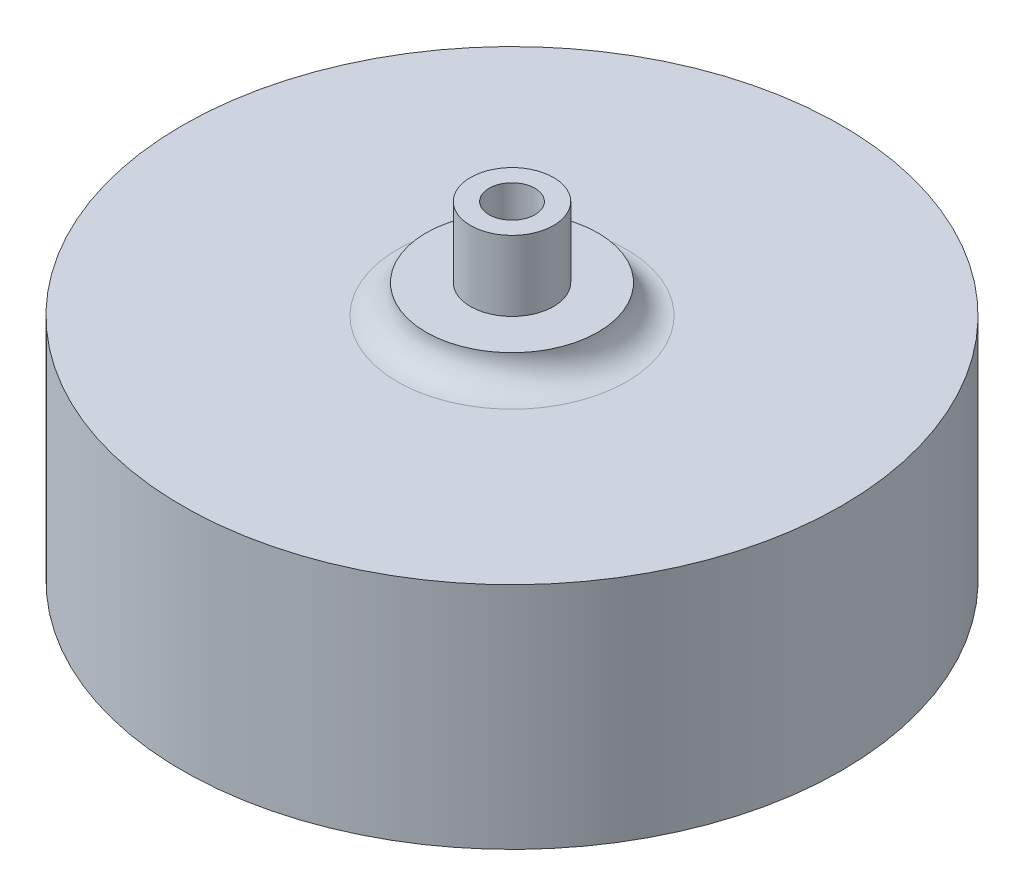
ISO-10303-21;
HEADER;
FILE_DESCRIPTION(('STEP AP214'),'2;1');
FILE_NAME('part.step','',(''),(''),'','','');
FILE_SCHEMA(('AUTOMOTIVE_DESIGN { 1 0 10303 214 1 1 1 1 }'));
ENDSEC;
DATA;
#1=APPLICATION_CONTEXT('core data for automotive mechanical design processes');
#2=APPLICATION_PROTOCOL_DEFINITION('international standard','automotive_design',2000,#1);
#3=PRODUCT_CONTEXT('',#1,'mechanical');
#4=PRODUCT('Part','Part','',(#3));
#5=PRODUCT_RELATED_PRODUCT_CATEGORY('part','',(#4));
#6=PRODUCT_DEFINITION_FORMATION('','',#4);
#7=PRODUCT_DEFINITION_CONTEXT('part definition',#1,'design');
#8=PRODUCT_DEFINITION('design','',#6,#7);
#9=PRODUCT_DEFINITION_SHAPE('','',#8);
#10=(LENGTH_UNIT() NAMED_UNIT(*) SI_UNIT(.MILLI.,.METRE.));
#11=(NAMED_UNIT(*) PLANE_ANGLE_UNIT() SI_UNIT($,.RADIAN.));
#12=(NAMED_UNIT(*) SI_UNIT($,.STERADIAN.) SOLID_ANGLE_UNIT());
#13=UNCERTAINTY_MEASURE_WITH_UNIT(LENGTH_MEASURE(1.E-05),#10,'distance_accuracy_value','');
#14=(GEOMETRIC_REPRESENTATION_CONTEXT(3) GLOBAL_UNCERTAINTY_ASSIGNED_CONTEXT((#13)) GLOBAL_UNIT_ASSIGNED_CONTEXT((#10,
#11,#12)) REPRESENTATION_CONTEXT('',''));
#15=CARTESIAN_POINT('',(0.,0.,0.));
#16=DIRECTION('',(0.,0.,1.));
#17=DIRECTION('',(1.,0.,0.));
#18=AXIS2_PLACEMENT_3D('',#15,#16,#17);
#19=CARTESIAN_POINT('',(-1.6,5.73999456703665,0.));
#20=DIRECTION('',(0.,1.,0.));
#21=DIRECTION('',(-1.,0.,0.));
#22=AXIS2_PLACEMENT_3D('',#19,#20,#21);
#23=CYLINDRICAL_SURFACE('',#22,1.6);
#24=CARTESIAN_POINT('',(-1.6,-29.8,0.));
#25=DIRECTION('',(0.,1.,0.));
#26=DIRECTION('',(-1.,0.,0.));
#27=AXIS2_PLACEMENT_3D('',#24,#25,#26);
#28=CIRCLE('',#27,1.6);
#29=CARTESIAN_POINT('',(-3.2,-29.8,0.));
#30=VERTEX_POINT('',#29);
#31=EDGE_CURVE('E74',#30,#30,#28,.T.);
#32=ORIENTED_EDGE('',*,*,#31,.F.);
#33=EDGE_LOOP('',(#32));
#34=FACE_BOUND('',#33,.T.);
#35=CARTESIAN_POINT('',(-1.6,0.,0.));
#36=DIRECTION('',(0.,1.,0.));
#37=DIRECTION('',(-1.,0.,0.));
#38=AXIS2_PLACEMENT_3D('',#35,#36,#37);
#39=CIRCLE('',#38,1.6);
#40=CARTESIAN_POINT('',(-3.2,0.,0.));
#41=VERTEX_POINT('',#40);
#42=EDGE_CURVE('E44',#41,#41,#39,.T.);
#43=ORIENTED_EDGE('',*,*,#42,.T.);
#44=EDGE_LOOP('',(#43));
#45=FACE_BOUND('',#44,.T.);
#46=ADVANCED_FACE('F33',(#34,#45),#23,.F.);
#47=CARTESIAN_POINT('',(0.,0.,0.));
#48=DIRECTION('',(0.,-1.,0.));
#49=DIRECTION('',(1.,0.,0.));
#50=AXIS2_PLACEMENT_3D('',#47,#48,#49);
#51=PLANE('',#50);
#52=ORIENTED_EDGE('',*,*,#42,.F.);
#53=EDGE_LOOP('',(#52));
#54=FACE_BOUND('',#53,.T.);
#55=CARTESIAN_POINT('',(-1.6,0.,0.));
#56=DIRECTION('',(0.,1.,0.));
#57=DIRECTION('',(-1.,0.,0.));
#58=AXIS2_PLACEMENT_3D('',#55,#56,#57);
#59=CIRCLE('',#58,2.9);
#60=CARTESIAN_POINT('',(-4.5,0.,0.));
#61=VERTEX_POINT('',#60);
#62=EDGE_CURVE('E48',#61,#61,#59,.T.);
#63=ORIENTED_EDGE('',*,*,#62,.T.);
#64=EDGE_LOOP('',(#63));
#65=FACE_BOUND('',#64,.T.);
#66=ADVANCED_FACE('F82',(#54,#65),#51,.F.);
#67=CARTESIAN_POINT('',(-1.6,5.73999456703665,0.));
#68=DIRECTION('',(0.,1.,0.));
#69=DIRECTION('',(-1.,0.,0.));
#70=AXIS2_PLACEMENT_3D('',#67,#68,#69);
#71=CYLINDRICAL_SURFACE('',#70,2.9);
#72=ORIENTED_EDGE('',*,*,#62,.F.);
#73=EDGE_LOOP('',(#72));
#74=FACE_BOUND('',#73,.T.);
#75=CARTESIAN_POINT('',(-1.6,-4.9,0.));
#76=DIRECTION('',(0.,1.,0.));
#77=DIRECTION('',(-1.,0.,0.));
#78=AXIS2_PLACEMENT_3D('',#75,#76,#77);
#79=CIRCLE('',#78,2.9);
#80=CARTESIAN_POINT('',(-4.5,-4.9,0.));
#81=VERTEX_POINT('',#80);
#82=EDGE_CURVE('E53',#81,#81,#79,.T.);
#83=ORIENTED_EDGE('',*,*,#82,.T.);
#84=EDGE_LOOP('',(#83));
#85=FACE_BOUND('',#84,.T.);
#86=ADVANCED_FACE('F88',(#74,#85),#71,.T.);
#87=CARTESIAN_POINT('',(1.3,-4.9,0.));
#88=DIRECTION('',(0.,-1.,0.));
#89=DIRECTION('',(1.,0.,0.));
#90=AXIS2_PLACEMENT_3D('',#87,#88,#89);
#91=PLANE('',#90);
#92=ORIENTED_EDGE('',*,*,#82,.F.);
#93=EDGE_LOOP('',(#92));
#94=FACE_BOUND('',#93,.T.);
#95=CARTESIAN_POINT('',(-1.6,-4.9,0.));
#96=DIRECTION('',(0.,1.,0.));
#97=DIRECTION('',(-1.,0.,0.));
#98=AXIS2_PLACEMENT_3D('',#95,#96,#97);
#99=CIRCLE('',#98,6.);
#100=CARTESIAN_POINT('',(-7.6,-4.9,0.));
#101=VERTEX_POINT('',#100);
#102=EDGE_CURVE('E56',#101,#101,#99,.T.);
#103=ORIENTED_EDGE('',*,*,#102,.T.);
#104=EDGE_LOOP('',(#103));
#105=FACE_BOUND('',#104,.T.);
#106=ADVANCED_FACE('F94',(#94,#105),#91,.F.);
#107=CARTESIAN_POINT('',(4.4,-6.9,0.));
#108=DIRECTION('',(0.,-1.,0.));
#109=DIRECTION('',(1.,0.,0.));
#110=AXIS2_PLACEMENT_3D('',#107,#108,#109);
#111=PLANE('',#110);
#112=CARTESIAN_POINT('',(-1.6,-6.9,0.));
#113=DIRECTION('',(0.,-1.,0.));
#114=DIRECTION('',(1.,0.,0.));
#115=AXIS2_PLACEMENT_3D('',#112,#113,#114);
#116=CIRCLE('',#115,8.);
#117=CARTESIAN_POINT('',(6.4,-6.9,0.));
#118=VERTEX_POINT('',#117);
#119=EDGE_CURVE('E10',#118,#118,#116,.T.);
#120=ORIENTED_EDGE('',*,*,#119,.T.);
#121=EDGE_LOOP('',(#120));
#122=FACE_BOUND('',#121,.T.);
#123=CARTESIAN_POINT('',(-1.6,-6.9,0.));
#124=DIRECTION('',(0.,1.,0.));
#125=DIRECTION('',(-1.,0.,0.));
#126=AXIS2_PLACEMENT_3D('',#123,#124,#125);
#127=CIRCLE('',#126,23.);
#128=CARTESIAN_POINT('',(-24.6,-6.90000000000001,0.));
#129=VERTEX_POINT('',#128);
#130=EDGE_CURVE('E59',#129,#129,#127,.T.);
#131=ORIENTED_EDGE('',*,*,#130,.T.);
#132=EDGE_LOOP('',(#131));
#133=FACE_BOUND('',#132,.T.);
#134=ADVANCED_FACE('F100',(#122,#133),#111,.F.);
#135=CARTESIAN_POINT('',(-1.6,5.73999456703665,0.));
#136=DIRECTION('',(0.,1.,0.));
#137=DIRECTION('',(-1.,0.,0.));
#138=AXIS2_PLACEMENT_3D('',#135,#136,#137);
#139=CYLINDRICAL_SURFACE('',#138,23.);
#140=ORIENTED_EDGE('',*,*,#130,.F.);
#141=EDGE_LOOP('',(#140));
#142=FACE_BOUND('',#141,.T.);
#143=CARTESIAN_POINT('',(-1.6,-22.9,0.));
#144=DIRECTION('',(0.,1.,0.));
#145=DIRECTION('',(-1.,0.,0.));
#146=AXIS2_PLACEMENT_3D('',#143,#144,#145);
#147=CIRCLE('',#146,23.);
#148=CARTESIAN_POINT('',(-24.6,-22.9,0.));
#149=VERTEX_POINT('',#148);
#150=EDGE_CURVE('E62',#149,#149,#147,.T.);
#151=ORIENTED_EDGE('',*,*,#150,.T.);
#152=EDGE_LOOP('',(#151));
#153=FACE_BOUND('',#152,.T.);
#154=ADVANCED_FACE('F121',(#142,#153),#139,.T.);
#155=CARTESIAN_POINT('',(21.4,-22.9,0.));
#156=DIRECTION('',(0.,1.,0.));
#157=DIRECTION('',(-1.,0.,0.));
#158=AXIS2_PLACEMENT_3D('',#155,#156,#157);
#159=PLANE('',#158);
#160=CARTESIAN_POINT('',(-1.6,-22.9,0.));
#161=DIRECTION('',(0.,1.,0.));
#162=DIRECTION('',(-1.,0.,0.));
#163=AXIS2_PLACEMENT_3D('',#160,#161,#162);
#164=CIRCLE('',#163,8.);
#165=CARTESIAN_POINT('',(-9.6,-22.9,0.));
#166=VERTEX_POINT('',#165);
#167=EDGE_CURVE('E40',#166,#166,#164,.T.);
#168=ORIENTED_EDGE('',*,*,#167,.T.);
#169=EDGE_LOOP('',(#168));
#170=FACE_BOUND('',#169,.T.);
#171=ORIENTED_EDGE('',*,*,#150,.F.);
#172=EDGE_LOOP('',(#171));
#173=FACE_BOUND('',#172,.T.);
#174=ADVANCED_FACE('F124',(#170,#173),#159,.F.);
#175=CARTESIAN_POINT('',(4.4,-24.9,0.));
#176=DIRECTION('',(0.,1.,0.));
#177=DIRECTION('',(-1.,0.,0.));
#178=AXIS2_PLACEMENT_3D('',#175,#176,#177);
#179=PLANE('',#178);
#180=CARTESIAN_POINT('',(-1.6,-24.9,0.));
#181=DIRECTION('',(0.,1.,0.));
#182=DIRECTION('',(-1.,0.,0.));
#183=AXIS2_PLACEMENT_3D('',#180,#181,#182);
#184=CIRCLE('',#183,6.);
#185=CARTESIAN_POINT('',(-7.6,-24.9,0.));
#186=VERTEX_POINT('',#185);
#187=EDGE_CURVE('E65',#186,#186,#184,.T.);
#188=ORIENTED_EDGE('',*,*,#187,.F.);
#189=EDGE_LOOP('',(#188));
#190=FACE_BOUND('',#189,.T.);
#191=CARTESIAN_POINT('',(-1.6,-24.9,0.));
#192=DIRECTION('',(0.,1.,0.));
#193=DIRECTION('',(-1.,0.,0.));
#194=AXIS2_PLACEMENT_3D('',#191,#192,#193);
#195=CIRCLE('',#194,2.9);
#196=CARTESIAN_POINT('',(-4.5,-24.9,0.));
#197=VERTEX_POINT('',#196);
#198=EDGE_CURVE('E68',#197,#197,#195,.T.);
#199=ORIENTED_EDGE('',*,*,#198,.T.);
#200=EDGE_LOOP('',(#199));
#201=FACE_BOUND('',#200,.T.);
#202=ADVANCED_FACE('F128',(#190,#201),#179,.F.);
#203=CARTESIAN_POINT('',(-1.6,5.73999456703665,0.));
#204=DIRECTION('',(0.,1.,0.));
#205=DIRECTION('',(-1.,0.,0.));
#206=AXIS2_PLACEMENT_3D('',#203,#204,#205);
#207=CYLINDRICAL_SURFACE('',#206,2.9);
#208=ORIENTED_EDGE('',*,*,#198,.F.);
#209=EDGE_LOOP('',(#208));
#210=FACE_BOUND('',#209,.T.);
#211=CARTESIAN_POINT('',(-1.6,-29.8,0.));
#212=DIRECTION('',(0.,1.,0.));
#213=DIRECTION('',(-1.,0.,0.));
#214=AXIS2_PLACEMENT_3D('',#211,#212,#213);
#215=CIRCLE('',#214,2.9);
#216=CARTESIAN_POINT('',(-4.5,-29.8,0.));
#217=VERTEX_POINT('',#216);
#218=EDGE_CURVE('E71',#217,#217,#215,.T.);
#219=ORIENTED_EDGE('',*,*,#218,.T.);
#220=EDGE_LOOP('',(#219));
#221=FACE_BOUND('',#220,.T.);
#222=ADVANCED_FACE('F114',(#210,#221),#207,.T.);
#223=CARTESIAN_POINT('',(1.3,-29.8,0.));
#224=DIRECTION('',(0.,1.,0.));
#225=DIRECTION('',(-1.,0.,0.));
#226=AXIS2_PLACEMENT_3D('',#223,#224,#225);
#227=PLANE('',#226);
#228=ORIENTED_EDGE('',*,*,#218,.F.);
#229=EDGE_LOOP('',(#228));
#230=FACE_BOUND('',#229,.T.);
#231=ORIENTED_EDGE('',*,*,#31,.T.);
#232=EDGE_LOOP('',(#231));
#233=FACE_BOUND('',#232,.T.);
#234=ADVANCED_FACE('F78',(#230,#233),#227,.F.);
#235=CARTESIAN_POINT('',(-1.6,-24.9,0.));
#236=DIRECTION('',(0.,1.,0.));
#237=DIRECTION('',(-1.,0.,0.));
#238=AXIS2_PLACEMENT_3D('',#235,#236,#237);
#239=TOROIDAL_SURFACE('',#238,8.,2.);
#240=ORIENTED_EDGE('',*,*,#187,.T.);
#241=EDGE_LOOP('',(#240));
#242=FACE_BOUND('',#241,.T.);
#243=ORIENTED_EDGE('',*,*,#167,.F.);
#244=EDGE_LOOP('',(#243));
#245=FACE_BOUND('',#244,.T.);
#246=ADVANCED_FACE('F105',(#242,#245),#239,.F.);
#247=CARTESIAN_POINT('',(-1.6,-4.9,0.));
#248=DIRECTION('',(0.,-1.,0.));
#249=DIRECTION('',(1.,0.,0.));
#250=AXIS2_PLACEMENT_3D('',#247,#248,#249);
#251=TOROIDAL_SURFACE('',#250,8.,2.);
#252=ORIENTED_EDGE('',*,*,#119,.F.);
#253=EDGE_LOOP('',(#252));
#254=FACE_BOUND('',#253,.T.);
#255=ORIENTED_EDGE('',*,*,#102,.F.);
#256=EDGE_LOOP('',(#255));
#257=FACE_BOUND('',#256,.T.);
#258=ADVANCED_FACE('F35',(#254,#257),#251,.F.);
#259=CLOSED_SHELL('',(#46,#66,#86,#106,#134,#154,#174,#202,#222,#234,#246,#258));
#260=MANIFOLD_SOLID_BREP('B2',#259);
#261=ADVANCED_BREP_SHAPE_REPRESENTATION('',(#18,#260),#14);
#262=SHAPE_DEFINITION_REPRESENTATION(#9,#261);
ENDSEC;
END-ISO-10303-21;
